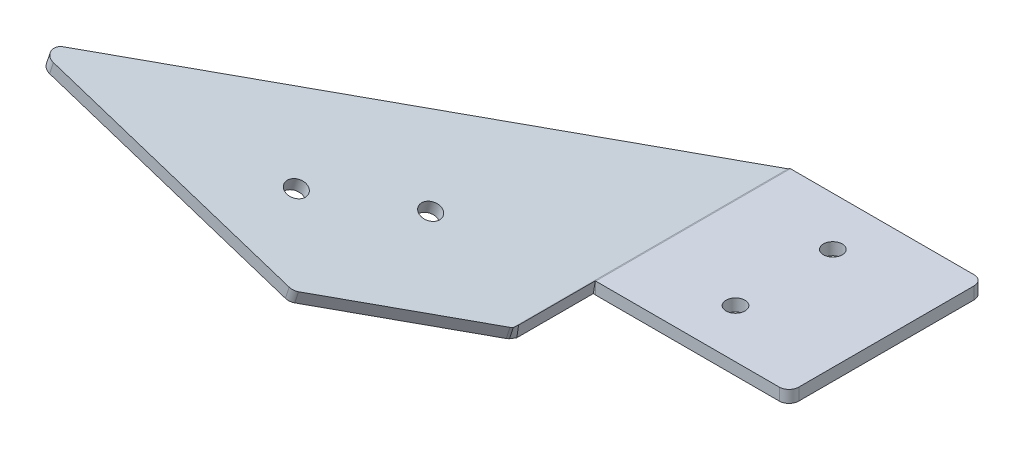
ISO-10303-21;
HEADER;
FILE_DESCRIPTION(('STEP AP214'),'2;1');
FILE_NAME('part.step','',(''),(''),'','','');
FILE_SCHEMA(('AUTOMOTIVE_DESIGN { 1 0 10303 214 1 1 1 1 }'));
ENDSEC;
DATA;
#1=APPLICATION_CONTEXT('core data for automotive mechanical design processes');
#2=APPLICATION_PROTOCOL_DEFINITION('international standard','automotive_design',2000,#1);
#3=PRODUCT_CONTEXT('',#1,'mechanical');
#4=PRODUCT('Part','Part','',(#3));
#5=PRODUCT_RELATED_PRODUCT_CATEGORY('part','',(#4));
#6=PRODUCT_DEFINITION_FORMATION('','',#4);
#7=PRODUCT_DEFINITION_CONTEXT('part definition',#1,'design');
#8=PRODUCT_DEFINITION('design','',#6,#7);
#9=PRODUCT_DEFINITION_SHAPE('','',#8);
#10=(LENGTH_UNIT() NAMED_UNIT(*) SI_UNIT(.MILLI.,.METRE.));
#11=(NAMED_UNIT(*) PLANE_ANGLE_UNIT() SI_UNIT($,.RADIAN.));
#12=(NAMED_UNIT(*) SI_UNIT($,.STERADIAN.) SOLID_ANGLE_UNIT());
#13=UNCERTAINTY_MEASURE_WITH_UNIT(LENGTH_MEASURE(1.E-05),#10,'distance_accuracy_value','');
#14=(GEOMETRIC_REPRESENTATION_CONTEXT(3) GLOBAL_UNCERTAINTY_ASSIGNED_CONTEXT((#13)) GLOBAL_UNIT_ASSIGNED_CONTEXT((#10,
#11,#12)) REPRESENTATION_CONTEXT('',''));
#15=CARTESIAN_POINT('',(0.,0.,0.));
#16=DIRECTION('',(0.,0.,1.));
#17=DIRECTION('',(1.,0.,0.));
#18=AXIS2_PLACEMENT_3D('',#15,#16,#17);
#19=CARTESIAN_POINT('',(-28.3121646155726,0.8635380411947,45.389946520126));
#20=DIRECTION('',(0.309016994374948,0.951056516295154,0.));
#21=DIRECTION('',(0.,0.,-1.));
#22=AXIS2_PLACEMENT_3D('',#19,#20,#21);
#23=PLANE('',#22);
#24=CARTESIAN_POINT('',(-71.2794365081163,14.8244509724767,58.2394877578618));
#25=DIRECTION('',(0.309016994374948,0.951056516295154,0.));
#26=DIRECTION('',(0.,0.,1.));
#27=AXIS2_PLACEMENT_3D('',#24,#25,#26);
#28=CIRCLE('',#27,2.4638);
#29=CARTESIAN_POINT('',(-71.2794365081163,14.8244509724767,60.7032877578618));
#30=VERTEX_POINT('',#29);
#31=EDGE_CURVE('E233',#30,#30,#28,.T.);
#32=ORIENTED_EDGE('',*,*,#31,.T.);
#33=EDGE_LOOP('',(#32));
#34=FACE_BOUND('',#33,.T.);
#35=CARTESIAN_POINT('',(-54.1979743042317,9.27434746197666,40.2789755157236));
#36=DIRECTION('',(0.309016994374948,0.951056516295154,0.));
#37=DIRECTION('',(0.,0.,1.));
#38=AXIS2_PLACEMENT_3D('',#35,#36,#37);
#39=CIRCLE('',#38,2.46379999999999);
#40=CARTESIAN_POINT('',(-54.1979743042317,9.27434746197666,42.7427755157236));
#41=VERTEX_POINT('',#40);
#42=EDGE_CURVE('E234',#41,#41,#39,.T.);
#43=ORIENTED_EDGE('',*,*,#42,.T.);
#44=EDGE_LOOP('',(#43));
#45=FACE_BOUND('',#44,.T.);
#46=CARTESIAN_POINT('',(-28.3121646155726,0.8635380411947,45.389946520126));
#47=DIRECTION('',(0.309016994374948,0.951056516295154,0.));
#48=DIRECTION('',(0.,0.,-1.));
#49=AXIS2_PLACEMENT_3D('',#46,#47,#48);
#50=CIRCLE('',#49,2.54);
#51=CARTESIAN_POINT('',(-26.6040183951841,0.308527690144693,47.1859977443398));
#52=VERTEX_POINT('',#51);
#53=CARTESIAN_POINT('',(-26.2436821008867,0.191447330859878,46.7019199053439));
#54=VERTEX_POINT('',#53);
#55=EDGE_CURVE('E266',#52,#54,#50,.T.);
#56=ORIENTED_EDGE('',*,*,#55,.F.);
#57=DIRECTION('',(0.672498511963953,-0.21850801222441,-0.707106781186551));
#58=VECTOR('',#57,1.);
#59=CARTESIAN_POINT('',(-26.6040183951841,0.308527690144693,47.1859977443398));
#60=LINE('',#59,#58);
#61=CARTESIAN_POINT('',(-53.4904369732305,9.04445464731431,75.4560512242138));
#62=VERTEX_POINT('',#61);
#63=EDGE_CURVE('E263',#62,#52,#60,.T.);
#64=ORIENTED_EDGE('',*,*,#63,.F.);
#65=CARTESIAN_POINT('',(-55.1985831936189,9.59946499836431,73.66));
#66=DIRECTION('',(0.309016994374948,0.951056516295154,0.));
#67=DIRECTION('',(0.,0.,1.));
#68=AXIS2_PLACEMENT_3D('',#65,#66,#67);
#69=CIRCLE('',#68,2.53999999999998);
#70=CARTESIAN_POINT('',(-55.1985831936189,9.59946499836431,76.2));
#71=VERTEX_POINT('',#70);
#72=EDGE_CURVE('E260',#71,#62,#69,.T.);
#73=ORIENTED_EDGE('',*,*,#72,.F.);
#74=DIRECTION('',(0.951056516295154,-0.309016994374948,0.));
#75=VECTOR('',#74,1.);
#76=CARTESIAN_POINT('',(-116.691847127603,29.5798376361644,76.2));
#77=LINE('',#76,#75);
#78=CARTESIAN_POINT('',(-116.691847127603,29.5798376361643,76.2));
#79=VERTEX_POINT('',#78);
#80=EDGE_CURVE('E257',#79,#71,#77,.T.);
#81=ORIENTED_EDGE('',*,*,#80,.F.);
#82=CARTESIAN_POINT('',(-116.691847127603,29.5798376361643,73.66));
#83=DIRECTION('',(0.309016994374948,0.951056516295154,0.));
#84=DIRECTION('',(0.,0.,1.));
#85=AXIS2_PLACEMENT_3D('',#82,#83,#84);
#86=CIRCLE('',#85,2.54000000000002);
#87=CARTESIAN_POINT('',(-118.399993347991,30.1348479872144,71.8639487757862));
#88=VERTEX_POINT('',#87);
#89=EDGE_CURVE('E254',#88,#79,#86,.T.);
#90=ORIENTED_EDGE('',*,*,#89,.F.);
#91=DIRECTION('',(-0.672498511963953,0.21850801222441,0.707106781186551));
#92=VECTOR('',#91,1.);
#93=CARTESIAN_POINT('',(-25.8964810641829,0.0786348754823292,-25.4));
#94=LINE('',#93,#92);
#95=CARTESIAN_POINT('',(-26.2436821008867,0.191447330859878,-25.0349312256896));
#96=VERTEX_POINT('',#95);
#97=EDGE_CURVE('E241',#96,#88,#94,.T.);
#98=ORIENTED_EDGE('',*,*,#97,.F.);
#99=DIRECTION('',(0.,0.,-1.));
#100=VECTOR('',#99,1.);
#101=CARTESIAN_POINT('',(-26.2436821008867,0.191447330859878,45.389946520126));
#102=LINE('',#101,#100);
#103=EDGE_CURVE('E53',#54,#96,#102,.T.);
#104=ORIENTED_EDGE('',*,*,#103,.F.);
#105=EDGE_LOOP('',(#56,#64,#73,#81,#90,#98,#104));
#106=FACE_BOUND('',#105,.T.);
#107=ADVANCED_FACE('F41',(#34,#45,#106),#23,.F.);
#108=CARTESIAN_POINT('',(-27.3310356584321,3.88314248043181,45.389946520126));
#109=DIRECTION('',(-0.309016994374948,-0.951056516295154,0.));
#110=DIRECTION('',(0.,0.,1.));
#111=AXIS2_PLACEMENT_3D('',#108,#109,#110);
#112=CYLINDRICAL_SURFACE('',#111,2.54);
#113=CARTESIAN_POINT('',(-25.2625531437462,3.21105177009699,46.7019199053439));
#114=CARTESIAN_POINT('',(-26.2436821008867,0.19144733085988,46.7019199053439));
#115=B_SPLINE_CURVE_WITH_KNOTS('',1,(#113,#114),.UNSPECIFIED.,.F.,.F.,(2,2),(0.,1.),.UNSPECIFIED.);
#116=CARTESIAN_POINT('',(-25.2625531437462,3.21105177009699,46.7019199053439));
#117=VERTEX_POINT('',#116);
#118=EDGE_CURVE('E11',#54,#117,#115,.F.);
#119=ORIENTED_EDGE('',*,*,#118,.T.);
#120=CARTESIAN_POINT('',(-27.3310356584321,3.88314248043181,45.389946520126));
#121=DIRECTION('',(0.309016994374948,0.951056516295154,0.));
#122=DIRECTION('',(0.,0.,-1.));
#123=AXIS2_PLACEMENT_3D('',#120,#121,#122);
#124=CIRCLE('',#123,2.54);
#125=CARTESIAN_POINT('',(-25.6228894380436,3.32813212938181,47.1859977443398));
#126=VERTEX_POINT('',#125);
#127=EDGE_CURVE('E253',#126,#117,#124,.T.);
#128=ORIENTED_EDGE('',*,*,#127,.F.);
#129=DIRECTION('',(-0.309016994374948,-0.951056516295154,0.));
#130=VECTOR('',#129,1.);
#131=CARTESIAN_POINT('',(-25.6228894380436,3.32813212938181,47.1859977443398));
#132=LINE('',#131,#130);
#133=EDGE_CURVE('E267',#126,#52,#132,.T.);
#134=ORIENTED_EDGE('',*,*,#133,.T.);
#135=ORIENTED_EDGE('',*,*,#55,.T.);
#136=EDGE_LOOP('',(#119,#128,#134,#135));
#137=FACE_BOUND('',#136,.T.);
#138=ADVANCED_FACE('F43',(#137),#112,.T.);
#139=CARTESIAN_POINT('',(-25.6228894380436,3.32813212938181,47.1859977443398));
#140=DIRECTION('',(0.672498511963961,-0.218508012224412,0.707106781186543));
#141=DIRECTION('',(0.672498511963953,-0.21850801222441,-0.707106781186551));
#142=AXIS2_PLACEMENT_3D('',#139,#140,#141);
#143=PLANE('',#142);
#144=ORIENTED_EDGE('',*,*,#63,.T.);
#145=ORIENTED_EDGE('',*,*,#133,.F.);
#146=DIRECTION('',(0.672498511963953,-0.21850801222441,-0.707106781186551));
#147=VECTOR('',#146,1.);
#148=CARTESIAN_POINT('',(-25.6228894380436,3.32813212938181,47.1859977443398));
#149=LINE('',#148,#147);
#150=CARTESIAN_POINT('',(-52.50930801609,12.0640590865514,75.4560512242138));
#151=VERTEX_POINT('',#150);
#152=EDGE_CURVE('E251',#151,#126,#149,.T.);
#153=ORIENTED_EDGE('',*,*,#152,.F.);
#154=DIRECTION('',(-0.309016994374948,-0.951056516295154,0.));
#155=VECTOR('',#154,1.);
#156=CARTESIAN_POINT('',(-52.50930801609,12.0640590865514,75.4560512242138));
#157=LINE('',#156,#155);
#158=EDGE_CURVE('E270',#151,#62,#157,.T.);
#159=ORIENTED_EDGE('',*,*,#158,.T.);
#160=EDGE_LOOP('',(#144,#145,#153,#159));
#161=FACE_BOUND('',#160,.T.);
#162=ADVANCED_FACE('F522',(#161),#143,.T.);
#163=CARTESIAN_POINT('',(-54.2174542364784,12.6190694376014,73.66));
#164=DIRECTION('',(-0.309016994374948,-0.951056516295154,0.));
#165=DIRECTION('',(0.,0.,1.));
#166=AXIS2_PLACEMENT_3D('',#163,#164,#165);
#167=CYLINDRICAL_SURFACE('',#166,2.53999999999998);
#168=ORIENTED_EDGE('',*,*,#72,.T.);
#169=ORIENTED_EDGE('',*,*,#158,.F.);
#170=CARTESIAN_POINT('',(-54.2174542364784,12.6190694376014,73.66));
#171=DIRECTION('',(0.309016994374948,0.951056516295154,0.));
#172=DIRECTION('',(0.,0.,1.));
#173=AXIS2_PLACEMENT_3D('',#170,#171,#172);
#174=CIRCLE('',#173,2.53999999999998);
#175=CARTESIAN_POINT('',(-54.2174542364785,12.6190694376014,76.2));
#176=VERTEX_POINT('',#175);
#177=EDGE_CURVE('E249',#176,#151,#174,.T.);
#178=ORIENTED_EDGE('',*,*,#177,.F.);
#179=DIRECTION('',(-0.309016994374948,-0.951056516295154,0.));
#180=VECTOR('',#179,1.);
#181=CARTESIAN_POINT('',(-54.2174542364785,12.6190694376014,76.2));
#182=LINE('',#181,#180);
#183=EDGE_CURVE('E272',#176,#71,#182,.T.);
#184=ORIENTED_EDGE('',*,*,#183,.T.);
#185=EDGE_LOOP('',(#168,#169,#178,#184));
#186=FACE_BOUND('',#185,.T.);
#187=ADVANCED_FACE('F525',(#186),#167,.T.);
#188=CARTESIAN_POINT('',(-115.710718170462,32.5994420754015,76.2));
#189=DIRECTION('',(0.,0.,1.));
#190=DIRECTION('',(0.951056516295154,-0.309016994374948,0.));
#191=AXIS2_PLACEMENT_3D('',#188,#189,#190);
#192=PLANE('',#191);
#193=ORIENTED_EDGE('',*,*,#80,.T.);
#194=ORIENTED_EDGE('',*,*,#183,.F.);
#195=DIRECTION('',(0.951056516295154,-0.309016994374948,0.));
#196=VECTOR('',#195,1.);
#197=CARTESIAN_POINT('',(-115.710718170462,32.5994420754015,76.2));
#198=LINE('',#197,#196);
#199=CARTESIAN_POINT('',(-115.710718170462,32.5994420754015,76.2));
#200=VERTEX_POINT('',#199);
#201=EDGE_CURVE('E246',#200,#176,#198,.T.);
#202=ORIENTED_EDGE('',*,*,#201,.F.);
#203=DIRECTION('',(-0.309016994374948,-0.951056516295154,0.));
#204=VECTOR('',#203,1.);
#205=CARTESIAN_POINT('',(-115.710718170462,32.5994420754015,76.2));
#206=LINE('',#205,#204);
#207=EDGE_CURVE('E274',#200,#79,#206,.T.);
#208=ORIENTED_EDGE('',*,*,#207,.T.);
#209=EDGE_LOOP('',(#193,#194,#202,#208));
#210=FACE_BOUND('',#209,.T.);
#211=ADVANCED_FACE('F529',(#210),#192,.T.);
#212=CARTESIAN_POINT('',(-115.710718170462,32.5994420754015,73.66));
#213=DIRECTION('',(-0.309016994374948,-0.951056516295154,0.));
#214=DIRECTION('',(0.,0.,1.));
#215=AXIS2_PLACEMENT_3D('',#212,#213,#214);
#216=CYLINDRICAL_SURFACE('',#215,2.54000000000002);
#217=ORIENTED_EDGE('',*,*,#89,.T.);
#218=ORIENTED_EDGE('',*,*,#207,.F.);
#219=CARTESIAN_POINT('',(-115.710718170462,32.5994420754015,73.66));
#220=DIRECTION('',(0.309016994374948,0.951056516295154,0.));
#221=DIRECTION('',(0.,0.,1.));
#222=AXIS2_PLACEMENT_3D('',#219,#220,#221);
#223=CIRCLE('',#222,2.54000000000002);
#224=CARTESIAN_POINT('',(-117.418864390851,33.1544524264515,71.8639487757862));
#225=VERTEX_POINT('',#224);
#226=EDGE_CURVE('E244',#225,#200,#223,.T.);
#227=ORIENTED_EDGE('',*,*,#226,.F.);
#228=DIRECTION('',(-0.309016994374948,-0.951056516295154,0.));
#229=VECTOR('',#228,1.);
#230=CARTESIAN_POINT('',(-117.418864390851,33.1544524264515,71.8639487757862));
#231=LINE('',#230,#229);
#232=EDGE_CURVE('E276',#225,#88,#231,.T.);
#233=ORIENTED_EDGE('',*,*,#232,.T.);
#234=EDGE_LOOP('',(#217,#218,#227,#233));
#235=FACE_BOUND('',#234,.T.);
#236=ADVANCED_FACE('F327',(#235),#216,.T.);
#237=CARTESIAN_POINT('',(-24.9153521070424,3.09823931471944,-25.4));
#238=DIRECTION('',(-0.672498511963961,0.218508012224412,-0.707106781186544));
#239=DIRECTION('',(-0.672498511963954,0.21850801222441,0.707106781186551));
#240=AXIS2_PLACEMENT_3D('',#237,#238,#239);
#241=PLANE('',#240);
#242=CARTESIAN_POINT('',(-26.2436821008867,0.191447330859883,-25.0349312256896));
#243=CARTESIAN_POINT('',(-25.2625531437462,3.21105177009699,-25.0349312256896));
#244=B_SPLINE_CURVE_WITH_KNOTS('',1,(#242,#243),.UNSPECIFIED.,.F.,.F.,(2,2),(0.,1.),.UNSPECIFIED.);
#245=CARTESIAN_POINT('',(-25.2625531437462,3.21105177009699,-25.0349312256896));
#246=VERTEX_POINT('',#245);
#247=EDGE_CURVE('E283',#246,#96,#244,.F.);
#248=ORIENTED_EDGE('',*,*,#247,.T.);
#249=ORIENTED_EDGE('',*,*,#97,.T.);
#250=ORIENTED_EDGE('',*,*,#232,.F.);
#251=DIRECTION('',(-0.672498511963953,0.21850801222441,0.707106781186551));
#252=VECTOR('',#251,1.);
#253=CARTESIAN_POINT('',(-24.9153521070424,3.09823931471944,-25.4));
#254=LINE('',#253,#252);
#255=EDGE_CURVE('E247',#246,#225,#254,.T.);
#256=ORIENTED_EDGE('',*,*,#255,.F.);
#257=EDGE_LOOP('',(#248,#249,#250,#256));
#258=FACE_BOUND('',#257,.T.);
#259=ADVANCED_FACE('F313',(#258),#241,.T.);
#260=CARTESIAN_POINT('',(-27.3310356584321,3.88314248043181,45.389946520126));
#261=DIRECTION('',(0.309016994374948,0.951056516295154,0.));
#262=DIRECTION('',(0.,0.,-1.));
#263=AXIS2_PLACEMENT_3D('',#260,#261,#262);
#264=PLANE('',#263);
#265=DIRECTION('',(0.,0.,-1.));
#266=VECTOR('',#265,1.);
#267=CARTESIAN_POINT('',(-25.2625531437462,3.21105177009699,45.389946520126));
#268=LINE('',#267,#266);
#269=EDGE_CURVE('E269',#117,#246,#268,.T.);
#270=ORIENTED_EDGE('',*,*,#269,.T.);
#271=ORIENTED_EDGE('',*,*,#255,.T.);
#272=ORIENTED_EDGE('',*,*,#226,.T.);
#273=ORIENTED_EDGE('',*,*,#201,.T.);
#274=ORIENTED_EDGE('',*,*,#177,.T.);
#275=ORIENTED_EDGE('',*,*,#152,.T.);
#276=ORIENTED_EDGE('',*,*,#127,.T.);
#277=EDGE_LOOP('',(#270,#271,#272,#273,#274,#275,#276));
#278=FACE_BOUND('',#277,.T.);
#279=CARTESIAN_POINT('',(-53.2168453470912,12.2939519012138,40.2789755157236));
#280=DIRECTION('',(0.309016994374948,0.951056516295154,0.));
#281=DIRECTION('',(0.,0.,1.));
#282=AXIS2_PLACEMENT_3D('',#279,#280,#281);
#283=CIRCLE('',#282,2.46379999999999);
#284=CARTESIAN_POINT('',(-53.2168453470912,12.2939519012138,42.7427755157236));
#285=VERTEX_POINT('',#284);
#286=EDGE_CURVE('E230',#285,#285,#283,.T.);
#287=ORIENTED_EDGE('',*,*,#286,.F.);
#288=EDGE_LOOP('',(#287));
#289=FACE_BOUND('',#288,.T.);
#290=CARTESIAN_POINT('',(-70.2983075509758,17.8440554117138,58.2394877578618));
#291=DIRECTION('',(0.309016994374948,0.951056516295154,0.));
#292=DIRECTION('',(0.,0.,1.));
#293=AXIS2_PLACEMENT_3D('',#290,#291,#292);
#294=CIRCLE('',#293,2.4638);
#295=CARTESIAN_POINT('',(-70.2983075509758,17.8440554117138,60.7032877578618));
#296=VERTEX_POINT('',#295);
#297=EDGE_CURVE('E238',#296,#296,#294,.T.);
#298=ORIENTED_EDGE('',*,*,#297,.F.);
#299=EDGE_LOOP('',(#298));
#300=FACE_BOUND('',#299,.T.);
#301=ADVANCED_FACE('F331',(#278,#289,#300),#264,.T.);
#302=CARTESIAN_POINT('',(-70.2983075509758,17.8440554117138,58.2394877578618));
#303=DIRECTION('',(-0.309016994374948,-0.951056516295154,0.));
#304=DIRECTION('',(0.,0.,1.));
#305=AXIS2_PLACEMENT_3D('',#302,#303,#304);
#306=CYLINDRICAL_SURFACE('',#305,2.4638);
#307=ORIENTED_EDGE('',*,*,#297,.T.);
#308=EDGE_LOOP('',(#307));
#309=FACE_BOUND('',#308,.T.);
#310=ORIENTED_EDGE('',*,*,#31,.F.);
#311=EDGE_LOOP('',(#310));
#312=FACE_BOUND('',#311,.T.);
#313=ADVANCED_FACE('F517',(#309,#312),#306,.F.);
#314=CARTESIAN_POINT('',(-53.2168453470912,12.2939519012138,40.2789755157236));
#315=DIRECTION('',(-0.309016994374948,-0.951056516295154,0.));
#316=DIRECTION('',(0.,0.,1.));
#317=AXIS2_PLACEMENT_3D('',#314,#315,#316);
#318=CYLINDRICAL_SURFACE('',#317,2.46379999999999);
#319=ORIENTED_EDGE('',*,*,#286,.T.);
#320=EDGE_LOOP('',(#319));
#321=FACE_BOUND('',#320,.T.);
#322=ORIENTED_EDGE('',*,*,#42,.F.);
#323=EDGE_LOOP('',(#322));
#324=FACE_BOUND('',#323,.T.);
#325=ADVANCED_FACE('F485',(#321,#324),#318,.F.);
#326=CARTESIAN_POINT('',(22.86,3.175,22.86));
#327=DIRECTION('',(0.,-1.,0.));
#328=DIRECTION('',(0.,0.,1.));
#329=AXIS2_PLACEMENT_3D('',#326,#327,#328);
#330=CYLINDRICAL_SURFACE('',#329,2.54);
#331=CARTESIAN_POINT('',(22.86,0.,22.86));
#332=DIRECTION('',(0.,1.,0.));
#333=DIRECTION('',(0.,0.,1.));
#334=AXIS2_PLACEMENT_3D('',#331,#332,#333);
#335=CIRCLE('',#334,2.54);
#336=CARTESIAN_POINT('',(22.86,0.,25.4));
#337=VERTEX_POINT('',#336);
#338=CARTESIAN_POINT('',(25.4,0.,22.86));
#339=VERTEX_POINT('',#338);
#340=EDGE_CURVE('E790',#337,#339,#335,.T.);
#341=ORIENTED_EDGE('',*,*,#340,.T.);
#342=DIRECTION('',(0.,-1.,0.));
#343=VECTOR('',#342,1.);
#344=CARTESIAN_POINT('',(25.4,3.175,22.86));
#345=LINE('',#344,#343);
#346=CARTESIAN_POINT('',(25.4,3.175,22.86));
#347=VERTEX_POINT('',#346);
#348=EDGE_CURVE('E220',#347,#339,#345,.T.);
#349=ORIENTED_EDGE('',*,*,#348,.F.);
#350=CARTESIAN_POINT('',(22.86,3.175,22.86));
#351=DIRECTION('',(0.,1.,0.));
#352=DIRECTION('',(0.,0.,1.));
#353=AXIS2_PLACEMENT_3D('',#350,#351,#352);
#354=CIRCLE('',#353,2.54);
#355=CARTESIAN_POINT('',(22.86,3.175,25.4));
#356=VERTEX_POINT('',#355);
#357=EDGE_CURVE('E223',#356,#347,#354,.T.);
#358=ORIENTED_EDGE('',*,*,#357,.F.);
#359=DIRECTION('',(0.,-1.,0.));
#360=VECTOR('',#359,1.);
#361=CARTESIAN_POINT('',(22.86,3.175,25.4));
#362=LINE('',#361,#360);
#363=EDGE_CURVE('E237',#356,#337,#362,.T.);
#364=ORIENTED_EDGE('',*,*,#363,.T.);
#365=EDGE_LOOP('',(#341,#349,#358,#364));
#366=FACE_BOUND('',#365,.T.);
#367=ADVANCED_FACE('F481',(#366),#330,.T.);
#368=CARTESIAN_POINT('',(25.4,3.175,22.86));
#369=DIRECTION('',(1.,0.,0.));
#370=DIRECTION('',(0.,0.,-1.));
#371=AXIS2_PLACEMENT_3D('',#368,#369,#370);
#372=PLANE('',#371);
#373=DIRECTION('',(0.,0.,-1.));
#374=VECTOR('',#373,1.);
#375=CARTESIAN_POINT('',(25.4,0.,22.86));
#376=LINE('',#375,#374);
#377=CARTESIAN_POINT('',(25.4,0.,-22.86));
#378=VERTEX_POINT('',#377);
#379=EDGE_CURVE('E793',#339,#378,#376,.T.);
#380=ORIENTED_EDGE('',*,*,#379,.T.);
#381=DIRECTION('',(0.,-1.,0.));
#382=VECTOR('',#381,1.);
#383=CARTESIAN_POINT('',(25.4,3.175,-22.86));
#384=LINE('',#383,#382);
#385=CARTESIAN_POINT('',(25.4,3.175,-22.86));
#386=VERTEX_POINT('',#385);
#387=EDGE_CURVE('E215',#386,#378,#384,.T.);
#388=ORIENTED_EDGE('',*,*,#387,.F.);
#389=DIRECTION('',(0.,0.,-1.));
#390=VECTOR('',#389,1.);
#391=CARTESIAN_POINT('',(25.4,3.175,22.86));
#392=LINE('',#391,#390);
#393=EDGE_CURVE('E218',#347,#386,#392,.T.);
#394=ORIENTED_EDGE('',*,*,#393,.F.);
#395=ORIENTED_EDGE('',*,*,#348,.T.);
#396=EDGE_LOOP('',(#380,#388,#394,#395));
#397=FACE_BOUND('',#396,.T.);
#398=ADVANCED_FACE('F484',(#397),#372,.T.);
#399=CARTESIAN_POINT('',(22.86,3.175,-22.86));
#400=DIRECTION('',(0.,-1.,0.));
#401=DIRECTION('',(0.,0.,1.));
#402=AXIS2_PLACEMENT_3D('',#399,#400,#401);
#403=CYLINDRICAL_SURFACE('',#402,2.54);
#404=CARTESIAN_POINT('',(22.86,0.,-22.86));
#405=DIRECTION('',(0.,1.,0.));
#406=DIRECTION('',(0.,0.,-1.));
#407=AXIS2_PLACEMENT_3D('',#404,#405,#406);
#408=CIRCLE('',#407,2.54);
#409=CARTESIAN_POINT('',(22.86,0.,-25.4));
#410=VERTEX_POINT('',#409);
#411=EDGE_CURVE('E798',#378,#410,#408,.T.);
#412=ORIENTED_EDGE('',*,*,#411,.T.);
#413=DIRECTION('',(0.,-1.,0.));
#414=VECTOR('',#413,1.);
#415=CARTESIAN_POINT('',(22.86,3.175,-25.4));
#416=LINE('',#415,#414);
#417=CARTESIAN_POINT('',(22.86,3.175,-25.4));
#418=VERTEX_POINT('',#417);
#419=EDGE_CURVE('E212',#418,#410,#416,.T.);
#420=ORIENTED_EDGE('',*,*,#419,.F.);
#421=CARTESIAN_POINT('',(22.86,3.175,-22.86));
#422=DIRECTION('',(0.,1.,0.));
#423=DIRECTION('',(0.,0.,-1.));
#424=AXIS2_PLACEMENT_3D('',#421,#422,#423);
#425=CIRCLE('',#424,2.54);
#426=EDGE_CURVE('E196',#386,#418,#425,.T.);
#427=ORIENTED_EDGE('',*,*,#426,.F.);
#428=ORIENTED_EDGE('',*,*,#387,.T.);
#429=EDGE_LOOP('',(#412,#420,#427,#428));
#430=FACE_BOUND('',#429,.T.);
#431=ADVANCED_FACE('F489',(#430),#403,.T.);
#432=CARTESIAN_POINT('',(-1.27,3.175,-12.7));
#433=DIRECTION('',(0.,-1.,0.));
#434=DIRECTION('',(0.,0.,1.));
#435=AXIS2_PLACEMENT_3D('',#432,#433,#434);
#436=CYLINDRICAL_SURFACE('',#435,2.4638);
#437=CARTESIAN_POINT('',(-1.27,3.175,-12.7));
#438=DIRECTION('',(0.,1.,0.));
#439=DIRECTION('',(0.,0.,1.));
#440=AXIS2_PLACEMENT_3D('',#437,#438,#439);
#441=CIRCLE('',#440,2.4638);
#442=CARTESIAN_POINT('',(-1.27,3.175,-10.2362));
#443=VERTEX_POINT('',#442);
#444=EDGE_CURVE('E192',#443,#443,#441,.T.);
#445=ORIENTED_EDGE('',*,*,#444,.T.);
#446=EDGE_LOOP('',(#445));
#447=FACE_BOUND('',#446,.T.);
#448=CARTESIAN_POINT('',(-1.27,0.,-12.7));
#449=DIRECTION('',(0.,1.,0.));
#450=DIRECTION('',(0.,0.,1.));
#451=AXIS2_PLACEMENT_3D('',#448,#449,#450);
#452=CIRCLE('',#451,2.4638);
#453=CARTESIAN_POINT('',(-1.27,0.,-10.2362));
#454=VERTEX_POINT('',#453);
#455=EDGE_CURVE('E209',#454,#454,#452,.T.);
#456=ORIENTED_EDGE('',*,*,#455,.F.);
#457=EDGE_LOOP('',(#456));
#458=FACE_BOUND('',#457,.T.);
#459=ADVANCED_FACE('F493',(#447,#458),#436,.F.);
#460=CARTESIAN_POINT('',(-1.27,3.175,12.7));
#461=DIRECTION('',(0.,-1.,0.));
#462=DIRECTION('',(0.,0.,1.));
#463=AXIS2_PLACEMENT_3D('',#460,#461,#462);
#464=CYLINDRICAL_SURFACE('',#463,2.4638);
#465=CARTESIAN_POINT('',(-1.27,3.175,12.7));
#466=DIRECTION('',(0.,1.,0.));
#467=DIRECTION('',(0.,0.,1.));
#468=AXIS2_PLACEMENT_3D('',#465,#466,#467);
#469=CIRCLE('',#468,2.4638);
#470=CARTESIAN_POINT('',(-1.27,3.175,15.1638));
#471=VERTEX_POINT('',#470);
#472=EDGE_CURVE('E203',#471,#471,#469,.T.);
#473=ORIENTED_EDGE('',*,*,#472,.T.);
#474=EDGE_LOOP('',(#473));
#475=FACE_BOUND('',#474,.T.);
#476=CARTESIAN_POINT('',(-1.27,0.,12.7));
#477=DIRECTION('',(0.,1.,0.));
#478=DIRECTION('',(0.,0.,1.));
#479=AXIS2_PLACEMENT_3D('',#476,#477,#478);
#480=CIRCLE('',#479,2.4638);
#481=CARTESIAN_POINT('',(-1.27,0.,15.1638));
#482=VERTEX_POINT('',#481);
#483=EDGE_CURVE('E206',#482,#482,#480,.T.);
#484=ORIENTED_EDGE('',*,*,#483,.F.);
#485=EDGE_LOOP('',(#484));
#486=FACE_BOUND('',#485,.T.);
#487=ADVANCED_FACE('F497',(#475,#486),#464,.F.);
#488=CARTESIAN_POINT('',(-27.94,3.175,45.389946520126));
#489=DIRECTION('',(0.,1.,0.));
#490=DIRECTION('',(0.,0.,-1.));
#491=AXIS2_PLACEMENT_3D('',#488,#489,#490);
#492=PLANE('',#491);
#493=ORIENTED_EDGE('',*,*,#472,.F.);
#494=EDGE_LOOP('',(#493));
#495=FACE_BOUND('',#494,.T.);
#496=ORIENTED_EDGE('',*,*,#444,.F.);
#497=EDGE_LOOP('',(#496));
#498=FACE_BOUND('',#497,.T.);
#499=DIRECTION('',(1.,0.,0.));
#500=VECTOR('',#499,1.);
#501=CARTESIAN_POINT('',(-25.4,3.175,25.4));
#502=LINE('',#501,#500);
#503=CARTESIAN_POINT('',(-25.0349312256896,3.175,25.4));
#504=VERTEX_POINT('',#503);
#505=EDGE_CURVE('E802',#504,#356,#502,.T.);
#506=ORIENTED_EDGE('',*,*,#505,.T.);
#507=ORIENTED_EDGE('',*,*,#357,.T.);
#508=ORIENTED_EDGE('',*,*,#393,.T.);
#509=ORIENTED_EDGE('',*,*,#426,.T.);
#510=DIRECTION('',(-1.,0.,0.));
#511=VECTOR('',#510,1.);
#512=CARTESIAN_POINT('',(-25.4,3.175,-25.4));
#513=LINE('',#512,#511);
#514=CARTESIAN_POINT('',(-25.0349312256896,3.175,-25.4));
#515=VERTEX_POINT('',#514);
#516=EDGE_CURVE('E179',#418,#515,#513,.T.);
#517=ORIENTED_EDGE('',*,*,#516,.T.);
#518=DIRECTION('',(0.,0.,-1.));
#519=VECTOR('',#518,1.);
#520=CARTESIAN_POINT('',(-25.0349312256896,3.175,45.389946520126));
#521=LINE('',#520,#519);
#522=EDGE_CURVE('E185',#504,#515,#521,.T.);
#523=ORIENTED_EDGE('',*,*,#522,.F.);
#524=EDGE_LOOP('',(#506,#507,#508,#509,#517,#523));
#525=FACE_BOUND('',#524,.T.);
#526=ADVANCED_FACE('F194',(#495,#498,#525),#492,.T.);
#527=CARTESIAN_POINT('',(-25.4,3.175,-25.4));
#528=DIRECTION('',(0.,0.,-1.));
#529=DIRECTION('',(-1.,0.,0.));
#530=AXIS2_PLACEMENT_3D('',#527,#528,#529);
#531=PLANE('',#530);
#532=ORIENTED_EDGE('',*,*,#516,.F.);
#533=ORIENTED_EDGE('',*,*,#419,.T.);
#534=DIRECTION('',(-1.,0.,0.));
#535=VECTOR('',#534,1.);
#536=CARTESIAN_POINT('',(-25.4,0.,-25.4));
#537=LINE('',#536,#535);
#538=CARTESIAN_POINT('',(-25.0349312256896,0.,-25.4));
#539=VERTEX_POINT('',#538);
#540=EDGE_CURVE('E181',#410,#539,#537,.T.);
#541=ORIENTED_EDGE('',*,*,#540,.T.);
#542=DIRECTION('',(0.,-1.,0.));
#543=VECTOR('',#542,1.);
#544=CARTESIAN_POINT('',(-25.0349312256896,3.175,-25.4));
#545=LINE('',#544,#543);
#546=EDGE_CURVE('E166',#515,#539,#545,.T.);
#547=ORIENTED_EDGE('',*,*,#546,.F.);
#548=EDGE_LOOP('',(#532,#533,#541,#547));
#549=FACE_BOUND('',#548,.T.);
#550=ADVANCED_FACE('F176',(#549),#531,.T.);
#551=CARTESIAN_POINT('',(-27.94,0.,45.389946520126));
#552=DIRECTION('',(0.,1.,0.));
#553=DIRECTION('',(0.,0.,-1.));
#554=AXIS2_PLACEMENT_3D('',#551,#552,#553);
#555=PLANE('',#554);
#556=DIRECTION('',(0.,0.,-1.));
#557=VECTOR('',#556,1.);
#558=CARTESIAN_POINT('',(-25.0349312256896,0.,45.389946520126));
#559=LINE('',#558,#557);
#560=CARTESIAN_POINT('',(-25.0349312256896,0.,25.4));
#561=VERTEX_POINT('',#560);
#562=EDGE_CURVE('E226',#561,#539,#559,.T.);
#563=ORIENTED_EDGE('',*,*,#562,.T.);
#564=ORIENTED_EDGE('',*,*,#540,.F.);
#565=ORIENTED_EDGE('',*,*,#411,.F.);
#566=ORIENTED_EDGE('',*,*,#379,.F.);
#567=ORIENTED_EDGE('',*,*,#340,.F.);
#568=DIRECTION('',(1.,0.,0.));
#569=VECTOR('',#568,1.);
#570=CARTESIAN_POINT('',(-25.4,0.,25.4));
#571=LINE('',#570,#569);
#572=EDGE_CURVE('E182',#561,#337,#571,.T.);
#573=ORIENTED_EDGE('',*,*,#572,.F.);
#574=EDGE_LOOP('',(#563,#564,#565,#566,#567,#573));
#575=FACE_BOUND('',#574,.T.);
#576=ORIENTED_EDGE('',*,*,#455,.T.);
#577=EDGE_LOOP('',(#576));
#578=FACE_BOUND('',#577,.T.);
#579=ORIENTED_EDGE('',*,*,#483,.T.);
#580=EDGE_LOOP('',(#579));
#581=FACE_BOUND('',#580,.T.);
#582=ADVANCED_FACE('F507',(#575,#578,#581),#555,.F.);
#583=CARTESIAN_POINT('',(-25.4,3.175,25.4));
#584=DIRECTION('',(0.,0.,1.));
#585=DIRECTION('',(1.,0.,0.));
#586=AXIS2_PLACEMENT_3D('',#583,#584,#585);
#587=PLANE('',#586);
#588=ORIENTED_EDGE('',*,*,#572,.T.);
#589=ORIENTED_EDGE('',*,*,#363,.F.);
#590=ORIENTED_EDGE('',*,*,#505,.F.);
#591=DIRECTION('',(0.,1.,0.));
#592=VECTOR('',#591,1.);
#593=CARTESIAN_POINT('',(-25.0349312256896,3.175,25.4));
#594=LINE('',#593,#592);
#595=EDGE_CURVE('E763',#561,#504,#594,.T.);
#596=ORIENTED_EDGE('',*,*,#595,.F.);
#597=EDGE_LOOP('',(#588,#589,#590,#596));
#598=FACE_BOUND('',#597,.T.);
#599=ADVANCED_FACE('F510',(#598),#587,.T.);
#600=CARTESIAN_POINT('',(-25.0349312256896,3.9116,25.4));
#601=DIRECTION('',(1.18465814098229E-12,-1.87631416635385E-13,-1.));
#602=DIRECTION('',(-1.,0.,-1.18465814098229E-12));
#603=AXIS2_PLACEMENT_3D('',#600,#601,#602);
#604=PLANE('',#603);
#605=ORIENTED_EDGE('',*,*,#595,.T.);
#606=CARTESIAN_POINT('',(-25.0349312256896,3.9116,25.4));
#607=DIRECTION('',(1.18465814098229E-12,-1.87631416635385E-13,-1.));
#608=DIRECTION('',(-1.,0.,-1.18465814098229E-12));
#609=AXIS2_PLACEMENT_3D('',#606,#607,#608);
#610=CIRCLE('',#609,0.7366);
#611=CARTESIAN_POINT('',(-25.1501608526382,3.18406876831762,25.4));
#612=VERTEX_POINT('',#611);
#613=EDGE_CURVE('E188',#504,#612,#610,.T.);
#614=ORIENTED_EDGE('',*,*,#613,.T.);
#615=DIRECTION('',(0.156434465040232,0.987688340595138,0.));
#616=VECTOR('',#615,1.);
#617=CARTESIAN_POINT('',(-25.1501608526382,3.18406876831762,25.4));
#618=LINE('',#617,#616);
#619=CARTESIAN_POINT('',(-25.646840279141,0.0481582869280594,25.4));
#620=VERTEX_POINT('',#619);
#621=EDGE_CURVE('E229',#620,#612,#618,.T.);
#622=ORIENTED_EDGE('',*,*,#621,.F.);
#623=CARTESIAN_POINT('',(-25.0349312256896,3.9116,25.4));
#624=DIRECTION('',(0.,0.,1.));
#625=DIRECTION('',(-1.,0.,0.));
#626=AXIS2_PLACEMENT_3D('',#623,#624,#625);
#627=CIRCLE('',#626,3.9116);
#628=EDGE_CURVE('E343',#561,#620,#627,.F.);
#629=ORIENTED_EDGE('',*,*,#628,.F.);
#630=EDGE_LOOP('',(#605,#614,#622,#629));
#631=FACE_BOUND('',#630,.T.);
#632=ADVANCED_FACE('F480',(#631),#604,.F.);
#633=CARTESIAN_POINT('',(-25.1501608526382,3.18406876831762,35.394973260063));
#634=DIRECTION('',(-0.987688340595138,0.15643446504023,0.));
#635=DIRECTION('',(0.,0.,1.));
#636=AXIS2_PLACEMENT_3D('',#633,#634,#635);
#637=PLANE('',#636);
#638=ORIENTED_EDGE('',*,*,#621,.T.);
#639=DIRECTION('',(0.,0.,1.));
#640=VECTOR('',#639,1.);
#641=CARTESIAN_POINT('',(-25.1501608526382,3.18406876831762,45.3899465201259));
#642=LINE('',#641,#640);
#643=CARTESIAN_POINT('',(-25.1501608526382,3.18406876831762,45.3899465201259));
#644=VERTEX_POINT('',#643);
#645=EDGE_CURVE('E372',#612,#644,#642,.T.);
#646=ORIENTED_EDGE('',*,*,#645,.T.);
#647=CARTESIAN_POINT('',(-25.646840279141,0.0481582869280598,45.3899465201259));
#648=CARTESIAN_POINT('',(-25.1501608526382,3.18406876831762,45.3899465201259));
#649=B_SPLINE_CURVE_WITH_KNOTS('',1,(#647,#648),.UNSPECIFIED.,.F.,.F.,(2,2),(0.,1.),.UNSPECIFIED.);
#650=CARTESIAN_POINT('',(-25.646840279141,0.0481582869280594,45.3899465201259));
#651=VERTEX_POINT('',#650);
#652=EDGE_CURVE('E439',#651,#644,#649,.T.);
#653=ORIENTED_EDGE('',*,*,#652,.F.);
#654=DIRECTION('',(0.,0.,-1.));
#655=VECTOR('',#654,1.);
#656=CARTESIAN_POINT('',(-25.646840279141,0.0481582869280594,72.1754846182313));
#657=LINE('',#656,#655);
#658=EDGE_CURVE('E380',#620,#651,#657,.F.);
#659=ORIENTED_EDGE('',*,*,#658,.F.);
#660=EDGE_LOOP('',(#638,#646,#653,#659));
#661=FACE_BOUND('',#660,.T.);
#662=ADVANCED_FACE('F408',(#661),#637,.F.);
#663=CARTESIAN_POINT('',(-25.646840279141,0.0481582869280598,45.3899465201259));
#664=CARTESIAN_POINT('',(-25.8491302893698,0.0801978769814003,45.8272724415053));
#665=CARTESIAN_POINT('',(-26.0488947124949,0.128157071793619,46.2645939839646));
#666=CARTESIAN_POINT('',(-26.2436821008867,0.19144733085988,46.7019199053439));
#667=CARTESIAN_POINT('',(-25.1501608526382,3.18406876831762,45.3899465201259));
#668=CARTESIAN_POINT('',(-25.1882543043401,3.19010217834544,45.8272710448919));
#669=CARTESIAN_POINT('',(-25.2258725189173,3.19913351261997,46.264595380578));
#670=CARTESIAN_POINT('',(-25.2625531437462,3.21105177009699,46.7019199053439));
#671=B_SPLINE_SURFACE_WITH_KNOTS('',1,3,((#663,#664,#665,#666),(#667,#668,#669,#670)),
.UNSPECIFIED.,.F.,.F.,.F.,(2,2),(4,4),(0.,1.),(0.,1.),.UNSPECIFIED.);
#672=CARTESIAN_POINT('',(-25.1501608526382,3.18406876831762,45.3899465201259));
#673=CARTESIAN_POINT('',(-25.1882543043401,3.19010217834544,45.8272710448919));
#674=CARTESIAN_POINT('',(-25.2258725189173,3.19913351261997,46.264595380578));
#675=CARTESIAN_POINT('',(-25.2625531437462,3.21105177009699,46.7019199053439));
#676=B_SPLINE_CURVE_WITH_KNOTS('',3,(#672,#673,#674,#675),.UNSPECIFIED.,.F.,.F.,(4,4),(0.,1.),.UNSPECIFIED.);
#677=EDGE_CURVE('E335',#644,#117,#676,.T.);
#678=CARTESIAN_POINT('',(-26.2436821008867,0.19144733085988,46.7019199053439));
#679=CARTESIAN_POINT('',(-26.0488947124949,0.128157071793619,46.2645939839646));
#680=CARTESIAN_POINT('',(-25.8491302893698,0.0801978769814003,45.8272724415053));
#681=CARTESIAN_POINT('',(-25.646840279141,0.0481582869280598,45.3899465201259));
#682=B_SPLINE_CURVE_WITH_KNOTS('',3,(#678,#679,#680,#681),.UNSPECIFIED.,.F.,.F.,(4,4),(0.,1.),.UNSPECIFIED.);
#683=EDGE_CURVE('E60',#651,#54,#682,.F.);
#684=ORIENTED_EDGE('',*,*,#652,.T.);
#685=ORIENTED_EDGE('',*,*,#677,.T.);
#686=ORIENTED_EDGE('',*,*,#118,.F.);
#687=ORIENTED_EDGE('',*,*,#683,.F.);
#688=EDGE_LOOP('',(#684,#685,#686,#687));
#689=FACE_BOUND('',#688,.T.);
#690=ADVANCED_FACE('F396',(#689),#671,.T.);
#691=CARTESIAN_POINT('',(-26.2436821008867,0.191447330859883,-25.0349312256896));
#692=CARTESIAN_POINT('',(-26.0488927453478,0.128156432628775,-25.1566224522254));
#693=CARTESIAN_POINT('',(-25.8491323322855,0.080198200547459,-25.2783087734642));
#694=CARTESIAN_POINT('',(-25.646840279141,0.0481582869280585,-25.4));
#695=CARTESIAN_POINT('',(-25.2625531437462,3.21105177009699,-25.0349312256896));
#696=CARTESIAN_POINT('',(-25.2258724618724,3.19913349408493,-25.1566210239134));
#697=CARTESIAN_POINT('',(-25.1882543635823,3.19010218772848,-25.2783102017762));
#698=CARTESIAN_POINT('',(-25.1501608526383,3.18406876831762,-25.4));
#699=B_SPLINE_SURFACE_WITH_KNOTS('',1,3,((#691,#692,#693,#694),(#695,#696,#697,#698)),
.UNSPECIFIED.,.F.,.F.,.F.,(2,2),(4,4),(0.,1.),(0.,1.),.UNSPECIFIED.);
#700=CARTESIAN_POINT('',(-25.2625531437462,3.21105177009699,-25.0349312256896));
#701=CARTESIAN_POINT('',(-25.2258724618724,3.19913349408493,-25.1566210239134));
#702=CARTESIAN_POINT('',(-25.1882543635823,3.19010218772848,-25.2783102017762));
#703=CARTESIAN_POINT('',(-25.1501608526383,3.18406876831762,-25.4));
#704=B_SPLINE_CURVE_WITH_KNOTS('',3,(#700,#701,#702,#703),.UNSPECIFIED.,.F.,.F.,(4,4),(0.,1.),.UNSPECIFIED.);
#705=CARTESIAN_POINT('',(-25.1501608526383,3.18406876831762,-25.4));
#706=VERTEX_POINT('',#705);
#707=EDGE_CURVE('E173',#246,#706,#704,.T.);
#708=CARTESIAN_POINT('',(-25.1501608526383,3.18406876831762,-25.4));
#709=CARTESIAN_POINT('',(-25.646840279141,0.0481582869280585,-25.4));
#710=B_SPLINE_CURVE_WITH_KNOTS('',1,(#708,#709),.UNSPECIFIED.,.F.,.F.,(2,2),(0.,1.),.UNSPECIFIED.);
#711=CARTESIAN_POINT('',(-25.646840279141,0.0481582869280594,-25.4));
#712=VERTEX_POINT('',#711);
#713=EDGE_CURVE('E168',#712,#706,#710,.F.);
#714=CARTESIAN_POINT('',(-25.646840279141,0.0481582869280585,-25.4));
#715=CARTESIAN_POINT('',(-25.8491323322855,0.080198200547459,-25.2783087734642));
#716=CARTESIAN_POINT('',(-26.0488927453478,0.128156432628775,-25.1566224522254));
#717=CARTESIAN_POINT('',(-26.2436821008867,0.191447330859883,-25.0349312256896));
#718=B_SPLINE_CURVE_WITH_KNOTS('',3,(#714,#715,#716,#717),.UNSPECIFIED.,.F.,.F.,(4,4),(0.,1.),.UNSPECIFIED.);
#719=EDGE_CURVE('E69',#96,#712,#718,.F.);
#720=ORIENTED_EDGE('',*,*,#247,.F.);
#721=ORIENTED_EDGE('',*,*,#707,.T.);
#722=ORIENTED_EDGE('',*,*,#713,.F.);
#723=ORIENTED_EDGE('',*,*,#719,.F.);
#724=EDGE_LOOP('',(#720,#721,#722,#723));
#725=FACE_BOUND('',#724,.T.);
#726=ADVANCED_FACE('F407',(#725),#699,.T.);
#727=CARTESIAN_POINT('',(-25.0349312256896,3.9116,-25.4));
#728=DIRECTION('',(0.,0.,1.));
#729=DIRECTION('',(1.,0.,0.));
#730=AXIS2_PLACEMENT_3D('',#727,#728,#729);
#731=PLANE('',#730);
#732=CARTESIAN_POINT('',(-25.0349312256896,3.9116,-25.4));
#733=DIRECTION('',(0.,0.,1.));
#734=DIRECTION('',(-1.,0.,0.));
#735=AXIS2_PLACEMENT_3D('',#732,#733,#734);
#736=CIRCLE('',#735,3.9116);
#737=EDGE_CURVE('E764',#712,#539,#736,.T.);
#738=ORIENTED_EDGE('',*,*,#737,.F.);
#739=ORIENTED_EDGE('',*,*,#713,.T.);
#740=CARTESIAN_POINT('',(-25.0349312256896,3.9116,-25.4));
#741=DIRECTION('',(0.,0.,1.));
#742=DIRECTION('',(1.,0.,0.));
#743=AXIS2_PLACEMENT_3D('',#740,#741,#742);
#744=CIRCLE('',#743,0.7366);
#745=EDGE_CURVE('E163',#706,#515,#744,.T.);
#746=ORIENTED_EDGE('',*,*,#745,.T.);
#747=ORIENTED_EDGE('',*,*,#546,.T.);
#748=EDGE_LOOP('',(#738,#739,#746,#747));
#749=FACE_BOUND('',#748,.T.);
#750=ADVANCED_FACE('F165',(#749),#731,.F.);
#751=CARTESIAN_POINT('',(-25.0349312256896,3.9116,72.1754846182313));
#752=DIRECTION('',(0.,0.,-1.));
#753=DIRECTION('',(-1.,0.,0.));
#754=AXIS2_PLACEMENT_3D('',#751,#752,#753);
#755=CYLINDRICAL_SURFACE('',#754,0.7366);
#756=ORIENTED_EDGE('',*,*,#707,.F.);
#757=ORIENTED_EDGE('',*,*,#269,.F.);
#758=ORIENTED_EDGE('',*,*,#677,.F.);
#759=ORIENTED_EDGE('',*,*,#645,.F.);
#760=ORIENTED_EDGE('',*,*,#613,.F.);
#761=ORIENTED_EDGE('',*,*,#522,.T.);
#762=ORIENTED_EDGE('',*,*,#745,.F.);
#763=EDGE_LOOP('',(#756,#757,#758,#759,#760,#761,#762));
#764=FACE_BOUND('',#763,.T.);
#765=ADVANCED_FACE('F186',(#764),#755,.F.);
#766=CARTESIAN_POINT('',(-25.0349312256896,3.9116,72.1754846182313));
#767=DIRECTION('',(0.,0.,-1.));
#768=DIRECTION('',(-1.,0.,0.));
#769=AXIS2_PLACEMENT_3D('',#766,#767,#768);
#770=CYLINDRICAL_SURFACE('',#769,3.9116);
#771=ORIENTED_EDGE('',*,*,#719,.T.);
#772=ORIENTED_EDGE('',*,*,#737,.T.);
#773=ORIENTED_EDGE('',*,*,#562,.F.);
#774=ORIENTED_EDGE('',*,*,#628,.T.);
#775=ORIENTED_EDGE('',*,*,#658,.T.);
#776=ORIENTED_EDGE('',*,*,#683,.T.);
#777=ORIENTED_EDGE('',*,*,#103,.T.);
#778=EDGE_LOOP('',(#771,#772,#773,#774,#775,#776,#777));
#779=FACE_BOUND('',#778,.T.);
#780=ADVANCED_FACE('F319',(#779),#770,.T.);
#781=CLOSED_SHELL('',(#107,#138,#162,#187,#211,#236,#259,#301,#313,#325,#367,#398,#431,#459,
#487,#526,#550,#582,#599,#632,#662,#690,#726,#750,#765,#780));
#782=MANIFOLD_SOLID_BREP('B2',#781);
#783=ADVANCED_BREP_SHAPE_REPRESENTATION('',(#18,#782),#14);
#784=SHAPE_DEFINITION_REPRESENTATION(#9,#783);
ENDSEC;
END-ISO-10303-21;
